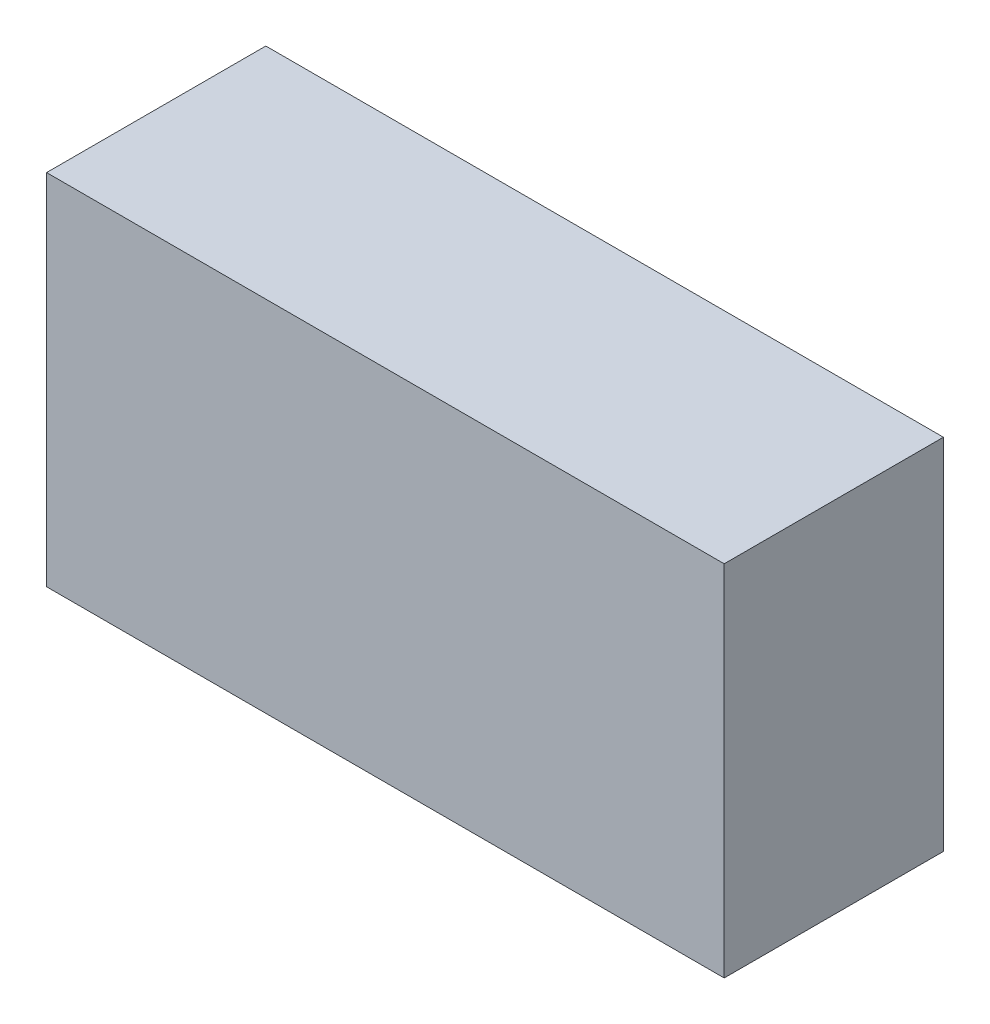
ISO-10303-21;
HEADER;
FILE_DESCRIPTION(('STEP AP214'),'2;1');
FILE_NAME('part.step','',(''),(''),'','','');
FILE_SCHEMA(('AUTOMOTIVE_DESIGN { 1 0 10303 214 1 1 1 1 }'));
ENDSEC;
DATA;
#1=APPLICATION_CONTEXT('core data for automotive mechanical design processes');
#2=APPLICATION_PROTOCOL_DEFINITION('international standard','automotive_design',2000,#1);
#3=PRODUCT_CONTEXT('',#1,'mechanical');
#4=PRODUCT('Part','Part','',(#3));
#5=PRODUCT_RELATED_PRODUCT_CATEGORY('part','',(#4));
#6=PRODUCT_DEFINITION_FORMATION('','',#4);
#7=PRODUCT_DEFINITION_CONTEXT('part definition',#1,'design');
#8=PRODUCT_DEFINITION('design','',#6,#7);
#9=PRODUCT_DEFINITION_SHAPE('','',#8);
#10=(LENGTH_UNIT() NAMED_UNIT(*) SI_UNIT(.MILLI.,.METRE.));
#11=(NAMED_UNIT(*) PLANE_ANGLE_UNIT() SI_UNIT($,.RADIAN.));
#12=(NAMED_UNIT(*) SI_UNIT($,.STERADIAN.) SOLID_ANGLE_UNIT());
#13=UNCERTAINTY_MEASURE_WITH_UNIT(LENGTH_MEASURE(1.E-05),#10,'distance_accuracy_value','');
#14=(GEOMETRIC_REPRESENTATION_CONTEXT(3) GLOBAL_UNCERTAINTY_ASSIGNED_CONTEXT((#13)) GLOBAL_UNIT_ASSIGNED_CONTEXT((#10,
#11,#12)) REPRESENTATION_CONTEXT('',''));
#15=CARTESIAN_POINT('',(0.,0.,0.));
#16=DIRECTION('',(0.,0.,1.));
#17=DIRECTION('',(1.,0.,0.));
#18=AXIS2_PLACEMENT_3D('',#15,#16,#17);
#19=CARTESIAN_POINT('',(3.,23.,28.));
#20=DIRECTION('',(1.,0.,0.));
#21=DIRECTION('',(0.,0.,-1.));
#22=AXIS2_PLACEMENT_3D('',#19,#20,#21);
#23=PLANE('',#22);
#24=DIRECTION('',(0.,-1.,0.));
#25=VECTOR('',#24,1.);
#26=CARTESIAN_POINT('',(3.,23.,17.));
#27=LINE('',#26,#25);
#28=CARTESIAN_POINT('',(3.,23.,17.));
#29=VERTEX_POINT('',#28);
#30=CARTESIAN_POINT('',(3.,5.,17.));
#31=VERTEX_POINT('',#30);
#32=EDGE_CURVE('E104',#29,#31,#27,.T.);
#33=ORIENTED_EDGE('',*,*,#32,.T.);
#34=DIRECTION('',(0.,0.,-1.));
#35=VECTOR('',#34,1.);
#36=CARTESIAN_POINT('',(3.,5.,28.));
#37=LINE('',#36,#35);
#38=CARTESIAN_POINT('',(3.,5.,28.));
#39=VERTEX_POINT('',#38);
#40=EDGE_CURVE('E11',#39,#31,#37,.T.);
#41=ORIENTED_EDGE('',*,*,#40,.F.);
#42=DIRECTION('',(0.,-1.,0.));
#43=VECTOR('',#42,1.);
#44=CARTESIAN_POINT('',(3.,23.,28.));
#45=LINE('',#44,#43);
#46=CARTESIAN_POINT('',(3.,23.,28.));
#47=VERTEX_POINT('',#46);
#48=EDGE_CURVE('E92',#47,#39,#45,.T.);
#49=ORIENTED_EDGE('',*,*,#48,.F.);
#50=DIRECTION('',(0.,0.,-1.));
#51=VECTOR('',#50,1.);
#52=CARTESIAN_POINT('',(3.,23.,28.));
#53=LINE('',#52,#51);
#54=EDGE_CURVE('E100',#47,#29,#53,.T.);
#55=ORIENTED_EDGE('',*,*,#54,.T.);
#56=EDGE_LOOP('',(#33,#41,#49,#55));
#57=FACE_BOUND('',#56,.T.);
#58=ADVANCED_FACE('F41',(#57),#23,.F.);
#59=CARTESIAN_POINT('',(3.,5.,28.));
#60=DIRECTION('',(0.,1.,0.));
#61=DIRECTION('',(0.,0.,1.));
#62=AXIS2_PLACEMENT_3D('',#59,#60,#61);
#63=PLANE('',#62);
#64=DIRECTION('',(1.,0.,0.));
#65=VECTOR('',#64,1.);
#66=CARTESIAN_POINT('',(3.,5.,17.));
#67=LINE('',#66,#65);
#68=CARTESIAN_POINT('',(37.,5.,17.));
#69=VERTEX_POINT('',#68);
#70=EDGE_CURVE('E96',#31,#69,#67,.T.);
#71=ORIENTED_EDGE('',*,*,#70,.T.);
#72=DIRECTION('',(0.,0.,-1.));
#73=VECTOR('',#72,1.);
#74=CARTESIAN_POINT('',(37.,5.,28.));
#75=LINE('',#74,#73);
#76=CARTESIAN_POINT('',(37.,5.,28.));
#77=VERTEX_POINT('',#76);
#78=EDGE_CURVE('E49',#77,#69,#75,.T.);
#79=ORIENTED_EDGE('',*,*,#78,.F.);
#80=DIRECTION('',(1.,0.,0.));
#81=VECTOR('',#80,1.);
#82=CARTESIAN_POINT('',(3.,5.,28.));
#83=LINE('',#82,#81);
#84=EDGE_CURVE('E87',#39,#77,#83,.T.);
#85=ORIENTED_EDGE('',*,*,#84,.F.);
#86=ORIENTED_EDGE('',*,*,#40,.T.);
#87=EDGE_LOOP('',(#71,#79,#85,#86));
#88=FACE_BOUND('',#87,.T.);
#89=ADVANCED_FACE('F95',(#88),#63,.F.);
#90=CARTESIAN_POINT('',(37.,5.,28.));
#91=DIRECTION('',(-1.,0.,0.));
#92=DIRECTION('',(0.,0.,1.));
#93=AXIS2_PLACEMENT_3D('',#90,#91,#92);
#94=PLANE('',#93);
#95=DIRECTION('',(0.,1.,0.));
#96=VECTOR('',#95,1.);
#97=CARTESIAN_POINT('',(37.,5.,17.));
#98=LINE('',#97,#96);
#99=CARTESIAN_POINT('',(37.,23.,17.));
#100=VERTEX_POINT('',#99);
#101=EDGE_CURVE('E74',#69,#100,#98,.T.);
#102=ORIENTED_EDGE('',*,*,#101,.T.);
#103=DIRECTION('',(0.,0.,-1.));
#104=VECTOR('',#103,1.);
#105=CARTESIAN_POINT('',(37.,23.,28.));
#106=LINE('',#105,#104);
#107=CARTESIAN_POINT('',(37.,23.,28.));
#108=VERTEX_POINT('',#107);
#109=EDGE_CURVE('E97',#108,#100,#106,.T.);
#110=ORIENTED_EDGE('',*,*,#109,.F.);
#111=DIRECTION('',(0.,1.,0.));
#112=VECTOR('',#111,1.);
#113=CARTESIAN_POINT('',(37.,5.,28.));
#114=LINE('',#113,#112);
#115=EDGE_CURVE('E90',#77,#108,#114,.T.);
#116=ORIENTED_EDGE('',*,*,#115,.F.);
#117=ORIENTED_EDGE('',*,*,#78,.T.);
#118=EDGE_LOOP('',(#102,#110,#116,#117));
#119=FACE_BOUND('',#118,.T.);
#120=ADVANCED_FACE('F98',(#119),#94,.F.);
#121=CARTESIAN_POINT('',(37.,23.,28.));
#122=DIRECTION('',(0.,-1.,0.));
#123=DIRECTION('',(0.,0.,-1.));
#124=AXIS2_PLACEMENT_3D('',#121,#122,#123);
#125=PLANE('',#124);
#126=DIRECTION('',(-1.,0.,0.));
#127=VECTOR('',#126,1.);
#128=CARTESIAN_POINT('',(37.,23.,17.));
#129=LINE('',#128,#127);
#130=EDGE_CURVE('E80',#100,#29,#129,.T.);
#131=ORIENTED_EDGE('',*,*,#130,.T.);
#132=ORIENTED_EDGE('',*,*,#54,.F.);
#133=DIRECTION('',(-1.,0.,0.));
#134=VECTOR('',#133,1.);
#135=CARTESIAN_POINT('',(37.,23.,28.));
#136=LINE('',#135,#134);
#137=EDGE_CURVE('E57',#108,#47,#136,.T.);
#138=ORIENTED_EDGE('',*,*,#137,.F.);
#139=ORIENTED_EDGE('',*,*,#109,.T.);
#140=EDGE_LOOP('',(#131,#132,#138,#139));
#141=FACE_BOUND('',#140,.T.);
#142=ADVANCED_FACE('F111',(#141),#125,.F.);
#143=CARTESIAN_POINT('',(0.,0.,28.));
#144=DIRECTION('',(0.,0.,1.));
#145=DIRECTION('',(1.,0.,0.));
#146=AXIS2_PLACEMENT_3D('',#143,#144,#145);
#147=PLANE('',#146);
#148=ORIENTED_EDGE('',*,*,#48,.T.);
#149=ORIENTED_EDGE('',*,*,#84,.T.);
#150=ORIENTED_EDGE('',*,*,#115,.T.);
#151=ORIENTED_EDGE('',*,*,#137,.T.);
#152=EDGE_LOOP('',(#148,#149,#150,#151));
#153=FACE_BOUND('',#152,.T.);
#154=ADVANCED_FACE('F88',(#153),#147,.T.);
#155=CARTESIAN_POINT('',(0.,0.,17.));
#156=DIRECTION('',(0.,0.,1.));
#157=DIRECTION('',(1.,0.,0.));
#158=AXIS2_PLACEMENT_3D('',#155,#156,#157);
#159=PLANE('',#158);
#160=ORIENTED_EDGE('',*,*,#32,.F.);
#161=ORIENTED_EDGE('',*,*,#130,.F.);
#162=ORIENTED_EDGE('',*,*,#101,.F.);
#163=ORIENTED_EDGE('',*,*,#70,.F.);
#164=EDGE_LOOP('',(#160,#161,#162,#163));
#165=FACE_BOUND('',#164,.T.);
#166=ADVANCED_FACE('F114',(#165),#159,.F.);
#167=CLOSED_SHELL('',(#58,#89,#120,#142,#154,#166));
#168=MANIFOLD_SOLID_BREP('B2',#167);
#169=ADVANCED_BREP_SHAPE_REPRESENTATION('',(#18,#168),#14);
#170=SHAPE_DEFINITION_REPRESENTATION(#9,#169);
ENDSEC;
END-ISO-10303-21;
